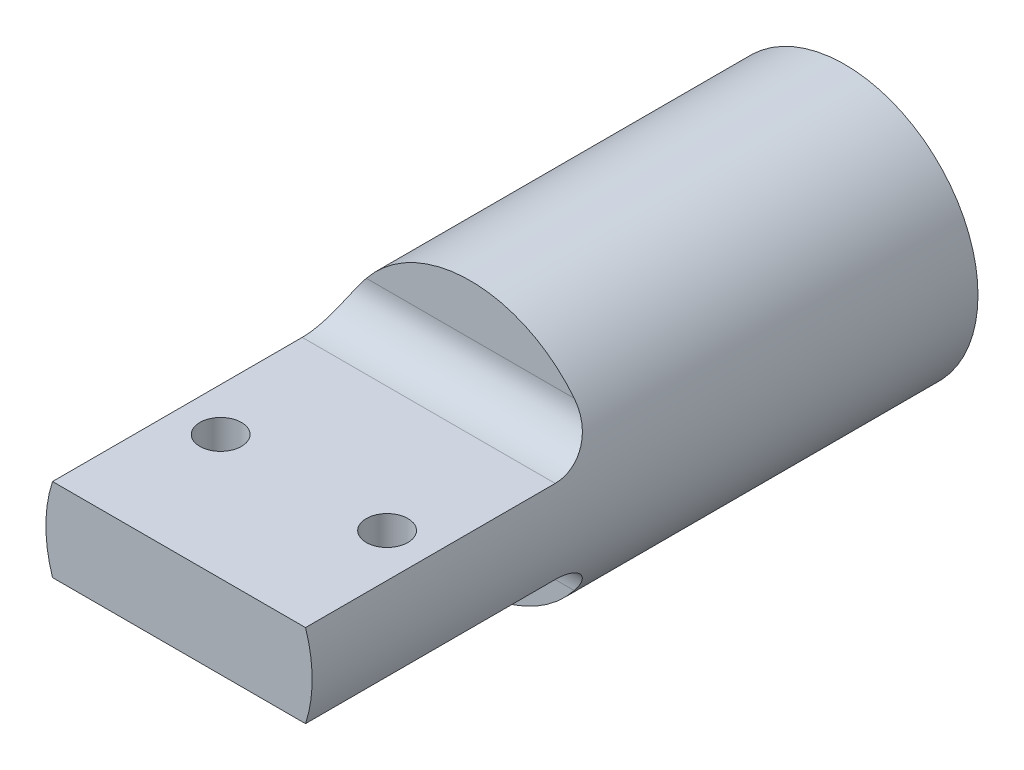
ISO-10303-21;
HEADER;
FILE_DESCRIPTION(('STEP AP214'),'2;1');
FILE_NAME('part.step','',(''),(''),'','','');
FILE_SCHEMA(('AUTOMOTIVE_DESIGN { 1 0 10303 214 1 1 1 1 }'));
ENDSEC;
DATA;
#1=APPLICATION_CONTEXT('core data for automotive mechanical design processes');
#2=APPLICATION_PROTOCOL_DEFINITION('international standard','automotive_design',2000,#1);
#3=PRODUCT_CONTEXT('',#1,'mechanical');
#4=PRODUCT('Part','Part','',(#3));
#5=PRODUCT_RELATED_PRODUCT_CATEGORY('part','',(#4));
#6=PRODUCT_DEFINITION_FORMATION('','',#4);
#7=PRODUCT_DEFINITION_CONTEXT('part definition',#1,'design');
#8=PRODUCT_DEFINITION('design','',#6,#7);
#9=PRODUCT_DEFINITION_SHAPE('','',#8);
#10=(LENGTH_UNIT() NAMED_UNIT(*) SI_UNIT(.MILLI.,.METRE.));
#11=(NAMED_UNIT(*) PLANE_ANGLE_UNIT() SI_UNIT($,.RADIAN.));
#12=(NAMED_UNIT(*) SI_UNIT($,.STERADIAN.) SOLID_ANGLE_UNIT());
#13=UNCERTAINTY_MEASURE_WITH_UNIT(LENGTH_MEASURE(1.E-05),#10,'distance_accuracy_value','');
#14=(GEOMETRIC_REPRESENTATION_CONTEXT(3) GLOBAL_UNCERTAINTY_ASSIGNED_CONTEXT((#13)) GLOBAL_UNIT_ASSIGNED_CONTEXT((#10,
#11,#12)) REPRESENTATION_CONTEXT('',''));
#15=CARTESIAN_POINT('',(0.,0.,0.));
#16=DIRECTION('',(0.,0.,1.));
#17=DIRECTION('',(1.,0.,0.));
#18=AXIS2_PLACEMENT_3D('',#15,#16,#17);
#19=CARTESIAN_POINT('',(0.,-5.,0.));
#20=DIRECTION('',(0.,1.,0.));
#21=DIRECTION('',(0.,0.,1.));
#22=AXIS2_PLACEMENT_3D('',#19,#20,#21);
#23=PLANE('',#22);
#24=DIRECTION('',(0.,0.,-1.));
#25=VECTOR('',#24,1.);
#26=CARTESIAN_POINT('',(-15.1986841535707,-5.,80.));
#27=LINE('',#26,#25);
#28=CARTESIAN_POINT('',(-15.1986841535707,-5.,50.));
#29=VERTEX_POINT('',#28);
#30=CARTESIAN_POINT('',(-15.1986841535707,-5.,80.));
#31=VERTEX_POINT('',#30);
#32=EDGE_CURVE('E104',#29,#31,#27,.F.);
#33=ORIENTED_EDGE('',*,*,#32,.F.);
#34=DIRECTION('',(1.,0.,0.));
#35=VECTOR('',#34,1.);
#36=CARTESIAN_POINT('',(0.,-5.,50.));
#37=LINE('',#36,#35);
#38=CARTESIAN_POINT('',(15.1986841535707,-5.,50.));
#39=VERTEX_POINT('',#38);
#40=EDGE_CURVE('E111',#29,#39,#37,.T.);
#41=ORIENTED_EDGE('',*,*,#40,.T.);
#42=DIRECTION('',(0.,0.,-1.));
#43=VECTOR('',#42,1.);
#44=CARTESIAN_POINT('',(15.1986841535707,-5.,80.));
#45=LINE('',#44,#43);
#46=CARTESIAN_POINT('',(15.1986841535707,-5.,80.));
#47=VERTEX_POINT('',#46);
#48=EDGE_CURVE('E117',#47,#39,#45,.T.);
#49=ORIENTED_EDGE('',*,*,#48,.F.);
#50=DIRECTION('',(1.,0.,0.));
#51=VECTOR('',#50,1.);
#52=CARTESIAN_POINT('',(-16.,-5.,80.));
#53=LINE('',#52,#51);
#54=EDGE_CURVE('E101',#31,#47,#53,.T.);
#55=ORIENTED_EDGE('',*,*,#54,.F.);
#56=EDGE_LOOP('',(#33,#41,#49,#55));
#57=FACE_BOUND('',#56,.T.);
#58=CARTESIAN_POINT('',(10.,-5.,65.));
#59=DIRECTION('',(0.,1.,0.));
#60=DIRECTION('',(0.,0.,1.));
#61=AXIS2_PLACEMENT_3D('',#58,#59,#60);
#62=CIRCLE('',#61,2.5);
#63=CARTESIAN_POINT('',(10.,-5.,67.5));
#64=VERTEX_POINT('',#63);
#65=EDGE_CURVE('E303',#64,#64,#62,.F.);
#66=ORIENTED_EDGE('',*,*,#65,.F.);
#67=EDGE_LOOP('',(#66));
#68=FACE_BOUND('',#67,.T.);
#69=CARTESIAN_POINT('',(-10.,-5.,65.));
#70=DIRECTION('',(0.,1.,0.));
#71=DIRECTION('',(0.,0.,1.));
#72=AXIS2_PLACEMENT_3D('',#69,#70,#71);
#73=CIRCLE('',#72,2.5);
#74=CARTESIAN_POINT('',(-10.,-5.,67.5));
#75=VERTEX_POINT('',#74);
#76=EDGE_CURVE('E300',#75,#75,#73,.T.);
#77=ORIENTED_EDGE('',*,*,#76,.T.);
#78=EDGE_LOOP('',(#77));
#79=FACE_BOUND('',#78,.T.);
#80=ADVANCED_FACE('F37',(#57,#68,#79),#23,.F.);
#81=CARTESIAN_POINT('',(0.,5.,0.));
#82=DIRECTION('',(0.,1.,0.));
#83=DIRECTION('',(0.,0.,1.));
#84=AXIS2_PLACEMENT_3D('',#81,#82,#83);
#85=PLANE('',#84);
#86=DIRECTION('',(0.,0.,-1.));
#87=VECTOR('',#86,1.);
#88=CARTESIAN_POINT('',(15.1986841535707,5.,80.));
#89=LINE('',#88,#87);
#90=CARTESIAN_POINT('',(15.1986841535707,5.,80.));
#91=VERTEX_POINT('',#90);
#92=CARTESIAN_POINT('',(15.1986841535707,5.,50.));
#93=VERTEX_POINT('',#92);
#94=EDGE_CURVE('E107',#91,#93,#89,.T.);
#95=ORIENTED_EDGE('',*,*,#94,.T.);
#96=DIRECTION('',(1.,0.,0.));
#97=VECTOR('',#96,1.);
#98=CARTESIAN_POINT('',(-15.1986841535707,5.,50.));
#99=LINE('',#98,#97);
#100=CARTESIAN_POINT('',(-15.1986841535707,5.,50.));
#101=VERTEX_POINT('',#100);
#102=EDGE_CURVE('E64',#93,#101,#99,.F.);
#103=ORIENTED_EDGE('',*,*,#102,.T.);
#104=DIRECTION('',(0.,0.,-1.));
#105=VECTOR('',#104,1.);
#106=CARTESIAN_POINT('',(-15.1986841535707,5.,80.));
#107=LINE('',#106,#105);
#108=CARTESIAN_POINT('',(-15.1986841535707,5.,80.));
#109=VERTEX_POINT('',#108);
#110=EDGE_CURVE('E112',#101,#109,#107,.F.);
#111=ORIENTED_EDGE('',*,*,#110,.T.);
#112=DIRECTION('',(1.,0.,0.));
#113=VECTOR('',#112,1.);
#114=CARTESIAN_POINT('',(-16.,5.,80.));
#115=LINE('',#114,#113);
#116=EDGE_CURVE('E99',#109,#91,#115,.T.);
#117=ORIENTED_EDGE('',*,*,#116,.T.);
#118=EDGE_LOOP('',(#95,#103,#111,#117));
#119=FACE_BOUND('',#118,.T.);
#120=CARTESIAN_POINT('',(10.,5.,65.));
#121=DIRECTION('',(0.,1.,0.));
#122=DIRECTION('',(0.,0.,1.));
#123=AXIS2_PLACEMENT_3D('',#120,#121,#122);
#124=CIRCLE('',#123,2.5);
#125=CARTESIAN_POINT('',(10.,5.,67.5));
#126=VERTEX_POINT('',#125);
#127=EDGE_CURVE('E307',#126,#126,#124,.F.);
#128=ORIENTED_EDGE('',*,*,#127,.T.);
#129=EDGE_LOOP('',(#128));
#130=FACE_BOUND('',#129,.T.);
#131=CARTESIAN_POINT('',(-10.,5.,65.));
#132=DIRECTION('',(0.,1.,0.));
#133=DIRECTION('',(0.,0.,1.));
#134=AXIS2_PLACEMENT_3D('',#131,#132,#133);
#135=CIRCLE('',#134,2.5);
#136=CARTESIAN_POINT('',(-10.,5.,67.5));
#137=VERTEX_POINT('',#136);
#138=EDGE_CURVE('E306',#137,#137,#135,.T.);
#139=ORIENTED_EDGE('',*,*,#138,.F.);
#140=EDGE_LOOP('',(#139));
#141=FACE_BOUND('',#140,.T.);
#142=ADVANCED_FACE('F114',(#119,#130,#141),#85,.T.);
#143=CARTESIAN_POINT('',(-16.,-5.,80.));
#144=DIRECTION('',(0.,0.,1.));
#145=DIRECTION('',(1.,0.,0.));
#146=AXIS2_PLACEMENT_3D('',#143,#144,#145);
#147=PLANE('',#146);
#148=ORIENTED_EDGE('',*,*,#116,.F.);
#149=CARTESIAN_POINT('',(0.,0.,80.));
#150=DIRECTION('',(0.,0.,-1.));
#151=DIRECTION('',(-1.,0.,0.));
#152=AXIS2_PLACEMENT_3D('',#149,#150,#151);
#153=CIRCLE('',#152,16.);
#154=EDGE_CURVE('E105',#31,#109,#153,.T.);
#155=ORIENTED_EDGE('',*,*,#154,.F.);
#156=ORIENTED_EDGE('',*,*,#54,.T.);
#157=EDGE_CURVE('E95',#91,#47,#153,.T.);
#158=ORIENTED_EDGE('',*,*,#157,.F.);
#159=EDGE_LOOP('',(#148,#155,#156,#158));
#160=FACE_BOUND('',#159,.T.);
#161=ADVANCED_FACE('F96',(#160),#147,.T.);
#162=CARTESIAN_POINT('',(0.,0.,0.));
#163=DIRECTION('',(0.,0.,1.));
#164=DIRECTION('',(1.,0.,0.));
#165=AXIS2_PLACEMENT_3D('',#162,#163,#164);
#166=PLANE('',#165);
#167=CARTESIAN_POINT('',(0.,0.,0.));
#168=DIRECTION('',(0.,0.,1.));
#169=DIRECTION('',(1.,0.,0.));
#170=AXIS2_PLACEMENT_3D('',#167,#168,#169);
#171=CIRCLE('',#170,16.);
#172=CARTESIAN_POINT('',(16.,0.,0.));
#173=VERTEX_POINT('',#172);
#174=EDGE_CURVE('E127',#173,#173,#171,.T.);
#175=ORIENTED_EDGE('',*,*,#174,.F.);
#176=EDGE_LOOP('',(#175));
#177=FACE_BOUND('',#176,.T.);
#178=CARTESIAN_POINT('',(0.,0.,0.));
#179=DIRECTION('',(0.,0.,1.));
#180=DIRECTION('',(1.,0.,0.));
#181=AXIS2_PLACEMENT_3D('',#178,#179,#180);
#182=CIRCLE('',#181,11.);
#183=CARTESIAN_POINT('',(11.,0.,0.));
#184=VERTEX_POINT('',#183);
#185=EDGE_CURVE('E119',#184,#184,#182,.T.);
#186=ORIENTED_EDGE('',*,*,#185,.T.);
#187=EDGE_LOOP('',(#186));
#188=FACE_BOUND('',#187,.T.);
#189=ADVANCED_FACE('F188',(#177,#188),#166,.F.);
#190=CARTESIAN_POINT('',(0.,0.,40.));
#191=DIRECTION('',(0.,0.,-1.));
#192=DIRECTION('',(-1.,0.,0.));
#193=AXIS2_PLACEMENT_3D('',#190,#191,#192);
#194=CYLINDRICAL_SURFACE('',#193,16.);
#195=CARTESIAN_POINT('',(0.,0.,45.));
#196=DIRECTION('',(0.,0.,1.));
#197=DIRECTION('',(1.,0.,0.));
#198=AXIS2_PLACEMENT_3D('',#195,#196,#197);
#199=CIRCLE('',#198,16.);
#200=CARTESIAN_POINT('',(-12.4899959967968,-10.,45.));
#201=VERTEX_POINT('',#200);
#202=CARTESIAN_POINT('',(12.4899959967968,-10.,45.));
#203=VERTEX_POINT('',#202);
#204=EDGE_CURVE('E290',#201,#203,#199,.T.);
#205=ORIENTED_EDGE('',*,*,#204,.F.);
#206=CARTESIAN_POINT('',(-12.4899959967968,-10.,45.));
#207=CARTESIAN_POINT('',(-12.600331952659,-9.86222903617671,44.9999952374629));
#208=CARTESIAN_POINT('',(-12.7083946214528,-9.72254818041764,45.0056959791728));
#209=CARTESIAN_POINT('',(-12.9195002586332,-9.44020223665848,45.029415002373));
#210=CARTESIAN_POINT('',(-13.0225367167774,-9.29753360339066,45.0474488271328));
#211=CARTESIAN_POINT('',(-13.2232961482015,-9.00973976843352,45.0968585548129));
#212=CARTESIAN_POINT('',(-13.3209924771084,-8.8646062813635,45.1282954961815));
#213=CARTESIAN_POINT('',(-13.5099006525632,-8.57394795633921,45.2053196764436));
#214=CARTESIAN_POINT('',(-13.6011158760118,-8.42842336380184,45.2508994789328));
#215=CARTESIAN_POINT('',(-13.7624992176116,-8.16173320901749,45.3483784367243));
#216=CARTESIAN_POINT('',(-13.8337000887229,-8.04039474253123,45.3981004895474));
#217=CARTESIAN_POINT('',(-13.9708594164327,-7.79963274255593,45.5082408035204));
#218=CARTESIAN_POINT('',(-14.0368187480734,-7.68020889210224,45.5686572738457));
#219=CARTESIAN_POINT('',(-14.1631394380018,-7.44468311940585,45.7001731495508));
#220=CARTESIAN_POINT('',(-14.2235115763714,-7.32857511213357,45.7712512585963));
#221=CARTESIAN_POINT('',(-14.3386093754636,-7.10074388553715,45.9240805856789));
#222=CARTESIAN_POINT('',(-14.3933376819721,-6.98901862697411,46.0058267615132));
#223=CARTESIAN_POINT('',(-14.4973643138585,-6.77060849833264,46.1802275701305));
#224=CARTESIAN_POINT('',(-14.5466324851401,-6.66395331280572,46.2729374504786));
#225=CARTESIAN_POINT('',(-14.639399117175,-6.45761516469905,46.4684690362881));
#226=CARTESIAN_POINT('',(-14.6828974270003,-6.35793238453568,46.5712910061389));
#227=CARTESIAN_POINT('',(-14.7642202695102,-6.16673365403791,46.7864667389672));
#228=CARTESIAN_POINT('',(-14.8020413894476,-6.07522262929909,46.8988261722097));
#229=CARTESIAN_POINT('',(-14.8721178301203,-5.901599762871,47.132202302159));
#230=CARTESIAN_POINT('',(-14.9043736236253,-5.81948712299682,47.2532182622647));
#231=CARTESIAN_POINT('',(-14.9611775492608,-5.67176584769048,47.4930823586906));
#232=CARTESIAN_POINT('',(-14.9861330502165,-5.60536616944647,47.6113479702924));
#233=CARTESIAN_POINT('',(-15.0316567488519,-5.48211756605954,47.8535606485813));
#234=CARTESIAN_POINT('',(-15.0522251204912,-5.42526826224188,47.977507489758));
#235=CARTESIAN_POINT('',(-15.0891360998023,-5.32174731337007,48.2300949497665));
#236=CARTESIAN_POINT('',(-15.105481539012,-5.27506885192346,48.3587323571188));
#237=CARTESIAN_POINT('',(-15.1341212942656,-5.19232912899181,48.6197616045545));
#238=CARTESIAN_POINT('',(-15.14641650593,-5.15626552044892,48.7521526075694));
#239=CARTESIAN_POINT('',(-15.1708484492499,-5.08402782193875,49.0682679026306));
#240=CARTESIAN_POINT('',(-15.1813172687334,-5.05253773080228,49.2532290968195));
#241=CARTESIAN_POINT('',(-15.191753294537,-5.02102910957874,49.5324142838184));
#242=CARTESIAN_POINT('',(-15.1943541125414,-5.01314733174432,49.6257343967451));
#243=CARTESIAN_POINT('',(-15.1978182255681,-5.00263324570863,49.8126941262772));
#244=CARTESIAN_POINT('',(-15.1986816679717,-5.00000049223338,49.9063337151063));
#245=CARTESIAN_POINT('',(-15.1986841535707,-5.,50.));
#246=B_SPLINE_CURVE_WITH_KNOTS('',3,(#206,#207,#208,#209,#210,#211,#212,#213,#214,#215,#216,
#217,#218,#219,#220,#221,#222,#223,#224,#225,#226,#227,#228,#229,#230,#231,#232,#233,#234,#235,
#236,#237,#238,#239,#240,#241,#242,#243,#244,#245),.UNSPECIFIED.,.F.,.F.,(4,2,2,2,2,2,2,2,2,2,2,
2,2,2,2,2,2,2,2,4),(0.,0.529510604269669,1.05968977860204,1.59230964757548,2.1246499349314,
2.57183709009181,3.01894943262078,3.46518028905748,3.91120099567281,4.35957357771012,
4.80795788596377,5.25661066268608,5.70522530796087,6.11843852749908,6.53163535916057,
6.94455441300638,7.35738209731477,7.91962281215641,8.20055126590746,8.48145588752518),.UNSPECIFIED.);
#247=EDGE_CURVE('E147',#201,#29,#246,.T.);
#248=ORIENTED_EDGE('',*,*,#247,.T.);
#249=ORIENTED_EDGE('',*,*,#32,.T.);
#250=ORIENTED_EDGE('',*,*,#154,.T.);
#251=ORIENTED_EDGE('',*,*,#110,.F.);
#252=CARTESIAN_POINT('',(-15.1986841535707,5.,50.));
#253=CARTESIAN_POINT('',(-15.1986766764511,4.99998207898774,49.8661485794503));
#254=CARTESIAN_POINT('',(-15.1969157844884,5.00537410108931,49.7322992557525));
#255=CARTESIAN_POINT('',(-15.1898329403202,5.02684908064224,49.4655627845222));
#256=CARTESIAN_POINT('',(-15.1845111795853,5.04293146326459,49.3326755856438));
#257=CARTESIAN_POINT('',(-15.1702605643503,5.08563370875157,49.0689582387952));
#258=CARTESIAN_POINT('',(-15.1613358586158,5.11224145103182,48.9381259040717));
#259=CARTESIAN_POINT('',(-15.1397771581325,5.1757393981251,48.6792948183878));
#260=CARTESIAN_POINT('',(-15.127143213009,5.21262946537234,48.5512960295425));
#261=CARTESIAN_POINT('',(-15.0980322025276,5.29635579000828,48.2989993621655));
#262=CARTESIAN_POINT('',(-15.0815539599772,5.34319509363718,48.1747026304436));
#263=CARTESIAN_POINT('',(-15.0445992284306,5.44637830248103,47.9306803438991));
#264=CARTESIAN_POINT('',(-15.0241212729001,5.50272569289574,47.8109564850741));
#265=CARTESIAN_POINT('',(-14.9790229699752,5.62432852396012,47.5770121692552));
#266=CARTESIAN_POINT('',(-14.954404612836,5.68957968181649,47.4627891018522));
#267=CARTESIAN_POINT('',(-14.900854902103,5.828383649293,47.2405087213281));
#268=CARTESIAN_POINT('',(-14.8719219633529,5.90193950759721,47.1324536945758));
#269=CARTESIAN_POINT('',(-14.8095069356797,6.05685552252824,46.9228829144776));
#270=CARTESIAN_POINT('',(-14.7760095752668,6.13824159644321,46.8213908759825));
#271=CARTESIAN_POINT('',(-14.7044235218652,6.30780453904752,46.6259164701966));
#272=CARTESIAN_POINT('',(-14.6663331628577,6.3959838676413,46.531936848565));
#273=CARTESIAN_POINT('',(-14.5855377048815,6.57814619187261,46.3520845404436));
#274=CARTESIAN_POINT('',(-14.5428360674511,6.67212481176709,46.2662058623281));
#275=CARTESIAN_POINT('',(-14.4527665661611,6.86504726793572,46.1028141694271));
#276=CARTESIAN_POINT('',(-14.4053970244498,6.96399288325282,46.0253041838541));
#277=CARTESIAN_POINT('',(-14.3044983751599,7.16901522465785,45.8766453605367));
#278=CARTESIAN_POINT('',(-14.2508234531491,7.27521804780295,45.8057695604748));
#279=CARTESIAN_POINT('',(-14.1386531621833,7.49087884713988,45.6732998394309));
#280=CARTESIAN_POINT('',(-14.0801558107093,7.60033815014525,45.6117097655769));
#281=CARTESIAN_POINT('',(-13.9584194413695,7.82166878376452,45.497734597612));
#282=CARTESIAN_POINT('',(-13.8951726793524,7.9335438321117,45.4453650242204));
#283=CARTESIAN_POINT('',(-13.7642293866937,8.15861193867894,45.3498126808048));
#284=CARTESIAN_POINT('',(-13.6965322222268,8.27180518273898,45.3066312230767));
#285=CARTESIAN_POINT('',(-13.5426671290002,8.52184696452857,45.2213081729626));
#286=CARTESIAN_POINT('',(-13.4555516844941,8.65880257390231,45.1811823375663));
#287=CARTESIAN_POINT('',(-13.2756799253766,8.93213988648186,45.1133325232941));
#288=CARTESIAN_POINT('',(-13.1829210798042,9.06852130241619,45.0856141562107));
#289=CARTESIAN_POINT('',(-12.9926746232483,9.33903666414921,45.0419935990581));
#290=CARTESIAN_POINT('',(-12.8952066936302,9.47317726329251,45.0260461129786));
#291=CARTESIAN_POINT('',(-12.6958270023584,9.73877198871524,45.005053444717));
#292=CARTESIAN_POINT('',(-12.5939200943071,9.87022882929432,44.9999966454392));
#293=CARTESIAN_POINT('',(-12.4899959967968,10.,45.));
#294=B_SPLINE_CURVE_WITH_KNOTS('',3,(#252,#253,#254,#255,#256,#257,#258,#259,#260,#261,#262,
#263,#264,#265,#266,#267,#268,#269,#270,#271,#272,#273,#274,#275,#276,#277,#278,#279,#280,#281,
#282,#283,#284,#285,#286,#287,#288,#289,#290,#291,#292,#293),.UNSPECIFIED.,.F.,.F.,(4,2,2,2,2,2,
2,2,2,2,2,2,2,2,2,2,2,2,2,2,4),(0.,0.40143117742957,0.802840771338058,1.20378945736879,
1.60473277942033,2.0057990390215,2.40701263053028,2.80803391050557,3.20920288840254,
3.61174864103098,4.01444085085461,4.41683284672802,4.81937001139568,5.2344346319642,
5.64967074632655,6.06559927400998,6.48158716701612,6.98258328468605,7.4838057702457,
7.98308927908098,8.48183993785733),.UNSPECIFIED.);
#295=CARTESIAN_POINT('',(-12.4899959967968,10.,45.));
#296=VERTEX_POINT('',#295);
#297=EDGE_CURVE('E11',#101,#296,#294,.T.);
#298=ORIENTED_EDGE('',*,*,#297,.T.);
#299=CARTESIAN_POINT('',(12.4899959967968,10.,45.));
#300=VERTEX_POINT('',#299);
#301=EDGE_CURVE('E292',#300,#296,#199,.T.);
#302=ORIENTED_EDGE('',*,*,#301,.F.);
#303=CARTESIAN_POINT('',(12.4899959967968,10.,45.));
#304=CARTESIAN_POINT('',(12.600331952659,9.86222903617671,44.9999952374629));
#305=CARTESIAN_POINT('',(12.7083946214528,9.72254818041764,45.0056959791728));
#306=CARTESIAN_POINT('',(12.9195002586332,9.44020223665848,45.029415002373));
#307=CARTESIAN_POINT('',(13.0225367167774,9.29753360339066,45.0474488271328));
#308=CARTESIAN_POINT('',(13.2232961482015,9.00973976843352,45.0968585548129));
#309=CARTESIAN_POINT('',(13.3209924771084,8.8646062813635,45.1282954961815));
#310=CARTESIAN_POINT('',(13.5099006525632,8.57394795633921,45.2053196764436));
#311=CARTESIAN_POINT('',(13.6011158760118,8.42842336380184,45.2508994789328));
#312=CARTESIAN_POINT('',(13.7624992176116,8.16173320901749,45.3483784367243));
#313=CARTESIAN_POINT('',(13.8337000887229,8.04039474253123,45.3981004895474));
#314=CARTESIAN_POINT('',(13.9708594164327,7.79963274255593,45.5082408035204));
#315=CARTESIAN_POINT('',(14.0368187480734,7.68020889210224,45.5686572738457));
#316=CARTESIAN_POINT('',(14.1631394380018,7.44468311940585,45.7001731495508));
#317=CARTESIAN_POINT('',(14.2235115763714,7.32857511213357,45.7712512585963));
#318=CARTESIAN_POINT('',(14.3386093754636,7.10074388553715,45.9240805856789));
#319=CARTESIAN_POINT('',(14.3933376819721,6.98901862697411,46.0058267615132));
#320=CARTESIAN_POINT('',(14.4973643138585,6.77060849833264,46.1802275701305));
#321=CARTESIAN_POINT('',(14.5466324851401,6.66395331280572,46.2729374504786));
#322=CARTESIAN_POINT('',(14.639399117175,6.45761516469905,46.4684690362881));
#323=CARTESIAN_POINT('',(14.6828974270003,6.35793238453568,46.5712910061389));
#324=CARTESIAN_POINT('',(14.7642202695102,6.16673365403791,46.7864667389672));
#325=CARTESIAN_POINT('',(14.8020413894476,6.07522262929909,46.8988261722097));
#326=CARTESIAN_POINT('',(14.8721178301203,5.901599762871,47.132202302159));
#327=CARTESIAN_POINT('',(14.9043736236253,5.81948712299682,47.2532182622647));
#328=CARTESIAN_POINT('',(14.9611775492608,5.67176584769048,47.4930823586906));
#329=CARTESIAN_POINT('',(14.9861330502165,5.60536616944647,47.6113479702924));
#330=CARTESIAN_POINT('',(15.0316567488519,5.48211756605954,47.8535606485813));
#331=CARTESIAN_POINT('',(15.0522251204912,5.42526826224188,47.977507489758));
#332=CARTESIAN_POINT('',(15.0891360998023,5.32174731337007,48.2300949497665));
#333=CARTESIAN_POINT('',(15.105481539012,5.27506885192346,48.3587323571188));
#334=CARTESIAN_POINT('',(15.1341212942656,5.19232912899181,48.6197616045545));
#335=CARTESIAN_POINT('',(15.14641650593,5.15626552044892,48.7521526075694));
#336=CARTESIAN_POINT('',(15.1708484492499,5.08402782193875,49.0682679026306));
#337=CARTESIAN_POINT('',(15.1813172687334,5.05253773080228,49.2532290968195));
#338=CARTESIAN_POINT('',(15.191753294537,5.02102910957874,49.5324142838184));
#339=CARTESIAN_POINT('',(15.1943541125414,5.01314733174432,49.6257343967451));
#340=CARTESIAN_POINT('',(15.1978182255681,5.00263324570863,49.8126941262772));
#341=CARTESIAN_POINT('',(15.1986816679717,5.00000049223338,49.9063337151063));
#342=CARTESIAN_POINT('',(15.1986841535707,5.,50.));
#343=B_SPLINE_CURVE_WITH_KNOTS('',3,(#303,#304,#305,#306,#307,#308,#309,#310,#311,#312,#313,
#314,#315,#316,#317,#318,#319,#320,#321,#322,#323,#324,#325,#326,#327,#328,#329,#330,#331,#332,
#333,#334,#335,#336,#337,#338,#339,#340,#341,#342),.UNSPECIFIED.,.F.,.F.,(4,2,2,2,2,2,2,2,2,2,2,
2,2,2,2,2,2,2,2,4),(0.,0.529510604269669,1.05968977860204,1.59230964757548,2.1246499349314,
2.57183709009181,3.01894943262078,3.46518028905748,3.91120099567281,4.35957357771012,
4.80795788596377,5.25661066268608,5.70522530796087,6.11843852749908,6.53163535916057,
6.94455441300638,7.35738209731477,7.91962281215641,8.20055126590746,8.48145588752518),.UNSPECIFIED.);
#344=EDGE_CURVE('E51',#300,#93,#343,.T.);
#345=ORIENTED_EDGE('',*,*,#344,.T.);
#346=ORIENTED_EDGE('',*,*,#94,.F.);
#347=ORIENTED_EDGE('',*,*,#157,.T.);
#348=ORIENTED_EDGE('',*,*,#48,.T.);
#349=CARTESIAN_POINT('',(15.1986841535707,-5.,50.));
#350=CARTESIAN_POINT('',(15.1986766764511,-4.99998207898774,49.8661485794503));
#351=CARTESIAN_POINT('',(15.1969157844884,-5.00537410108931,49.7322992557525));
#352=CARTESIAN_POINT('',(15.1898329403202,-5.02684908064224,49.4655627845222));
#353=CARTESIAN_POINT('',(15.1845111795853,-5.04293146326459,49.3326755856438));
#354=CARTESIAN_POINT('',(15.1702605643503,-5.08563370875157,49.0689582387952));
#355=CARTESIAN_POINT('',(15.1613358586158,-5.11224145103182,48.9381259040717));
#356=CARTESIAN_POINT('',(15.1397771581325,-5.1757393981251,48.6792948183878));
#357=CARTESIAN_POINT('',(15.127143213009,-5.21262946537234,48.5512960295425));
#358=CARTESIAN_POINT('',(15.0980322025276,-5.29635579000828,48.2989993621655));
#359=CARTESIAN_POINT('',(15.0815539599772,-5.34319509363718,48.1747026304436));
#360=CARTESIAN_POINT('',(15.0445992284306,-5.44637830248103,47.9306803438991));
#361=CARTESIAN_POINT('',(15.0241212729001,-5.50272569289574,47.8109564850741));
#362=CARTESIAN_POINT('',(14.9790229699752,-5.62432852396012,47.5770121692552));
#363=CARTESIAN_POINT('',(14.954404612836,-5.68957968181649,47.4627891018522));
#364=CARTESIAN_POINT('',(14.900854902103,-5.828383649293,47.2405087213281));
#365=CARTESIAN_POINT('',(14.8719219633529,-5.90193950759721,47.1324536945758));
#366=CARTESIAN_POINT('',(14.8095069356797,-6.05685552252824,46.9228829144776));
#367=CARTESIAN_POINT('',(14.7760095752668,-6.13824159644321,46.8213908759825));
#368=CARTESIAN_POINT('',(14.7044235218652,-6.30780453904752,46.6259164701966));
#369=CARTESIAN_POINT('',(14.6663331628577,-6.3959838676413,46.531936848565));
#370=CARTESIAN_POINT('',(14.5855377048815,-6.57814619187261,46.3520845404436));
#371=CARTESIAN_POINT('',(14.5428360674511,-6.67212481176709,46.2662058623281));
#372=CARTESIAN_POINT('',(14.4527665661611,-6.86504726793572,46.1028141694271));
#373=CARTESIAN_POINT('',(14.4053970244498,-6.96399288325282,46.0253041838541));
#374=CARTESIAN_POINT('',(14.3044983751599,-7.16901522465785,45.8766453605367));
#375=CARTESIAN_POINT('',(14.2508234531491,-7.27521804780295,45.8057695604748));
#376=CARTESIAN_POINT('',(14.1386531621833,-7.49087884713988,45.6732998394309));
#377=CARTESIAN_POINT('',(14.0801558107093,-7.60033815014525,45.6117097655769));
#378=CARTESIAN_POINT('',(13.9584194413695,-7.82166878376452,45.497734597612));
#379=CARTESIAN_POINT('',(13.8951726793524,-7.9335438321117,45.4453650242204));
#380=CARTESIAN_POINT('',(13.7642293866937,-8.15861193867894,45.3498126808048));
#381=CARTESIAN_POINT('',(13.6965322222268,-8.27180518273898,45.3066312230767));
#382=CARTESIAN_POINT('',(13.5426671290002,-8.52184696452857,45.2213081729626));
#383=CARTESIAN_POINT('',(13.4555516844941,-8.65880257390231,45.1811823375663));
#384=CARTESIAN_POINT('',(13.2756799253766,-8.93213988648186,45.1133325232941));
#385=CARTESIAN_POINT('',(13.1829210798042,-9.06852130241619,45.0856141562107));
#386=CARTESIAN_POINT('',(12.9926746232483,-9.33903666414921,45.0419935990581));
#387=CARTESIAN_POINT('',(12.8952066936302,-9.47317726329251,45.0260461129786));
#388=CARTESIAN_POINT('',(12.6958270023584,-9.73877198871524,45.005053444717));
#389=CARTESIAN_POINT('',(12.5939200943071,-9.87022882929432,44.9999966454392));
#390=CARTESIAN_POINT('',(12.4899959967968,-10.,45.));
#391=B_SPLINE_CURVE_WITH_KNOTS('',3,(#349,#350,#351,#352,#353,#354,#355,#356,#357,#358,#359,
#360,#361,#362,#363,#364,#365,#366,#367,#368,#369,#370,#371,#372,#373,#374,#375,#376,#377,#378,
#379,#380,#381,#382,#383,#384,#385,#386,#387,#388,#389,#390),.UNSPECIFIED.,.F.,.F.,(4,2,2,2,2,2,
2,2,2,2,2,2,2,2,2,2,2,2,2,2,4),(0.,0.40143117742957,0.802840771338058,1.20378945736879,
1.60473277942033,2.0057990390215,2.40701263053028,2.80803391050557,3.20920288840254,
3.61174864103098,4.01444085085461,4.41683284672802,4.81937001139568,5.2344346319642,
5.64967074632655,6.06559927400998,6.48158716701612,6.98258328468605,7.4838057702457,
7.98308927908098,8.48183993785733),.UNSPECIFIED.);
#392=EDGE_CURVE('E141',#39,#203,#391,.T.);
#393=ORIENTED_EDGE('',*,*,#392,.T.);
#394=EDGE_LOOP('',(#205,#248,#249,#250,#251,#298,#302,#345,#346,#347,#348,#393));
#395=FACE_BOUND('',#394,.T.);
#396=ORIENTED_EDGE('',*,*,#174,.T.);
#397=EDGE_LOOP('',(#396));
#398=FACE_BOUND('',#397,.T.);
#399=ADVANCED_FACE('F109',(#395,#398),#194,.T.);
#400=CARTESIAN_POINT('',(0.,0.,40.));
#401=DIRECTION('',(0.,0.,-1.));
#402=DIRECTION('',(-1.,0.,0.));
#403=AXIS2_PLACEMENT_3D('',#400,#401,#402);
#404=CYLINDRICAL_SURFACE('',#403,11.);
#405=CARTESIAN_POINT('',(0.,0.,40.));
#406=DIRECTION('',(0.,0.,1.));
#407=DIRECTION('',(1.,0.,0.));
#408=AXIS2_PLACEMENT_3D('',#405,#406,#407);
#409=CIRCLE('',#408,11.);
#410=CARTESIAN_POINT('',(11.,0.,40.));
#411=VERTEX_POINT('',#410);
#412=EDGE_CURVE('E124',#411,#411,#409,.T.);
#413=ORIENTED_EDGE('',*,*,#412,.T.);
#414=EDGE_LOOP('',(#413));
#415=FACE_BOUND('',#414,.T.);
#416=ORIENTED_EDGE('',*,*,#185,.F.);
#417=EDGE_LOOP('',(#416));
#418=FACE_BOUND('',#417,.T.);
#419=ADVANCED_FACE('F184',(#415,#418),#404,.F.);
#420=CARTESIAN_POINT('',(-16.,-5.,40.));
#421=DIRECTION('',(0.,0.,-1.));
#422=DIRECTION('',(-1.,0.,0.));
#423=AXIS2_PLACEMENT_3D('',#420,#421,#422);
#424=PLANE('',#423);
#425=ORIENTED_EDGE('',*,*,#412,.F.);
#426=EDGE_LOOP('',(#425));
#427=FACE_BOUND('',#426,.T.);
#428=ADVANCED_FACE('F180',(#427),#424,.T.);
#429=CARTESIAN_POINT('',(10.,-16.,65.));
#430=DIRECTION('',(0.,1.,0.));
#431=DIRECTION('',(0.,0.,1.));
#432=AXIS2_PLACEMENT_3D('',#429,#430,#431);
#433=CYLINDRICAL_SURFACE('',#432,2.5);
#434=CARTESIAN_POINT('',(10.,5.,67.5));
#435=CARTESIAN_POINT('',(10.,4.89583333333333,67.5));
#436=CARTESIAN_POINT('',(10.,4.79166666666667,67.5));
#437=CARTESIAN_POINT('',(10.,4.58333333333333,67.5));
#438=CARTESIAN_POINT('',(10.,4.47916666666667,67.5));
#439=CARTESIAN_POINT('',(10.,4.27083333333333,67.5));
#440=CARTESIAN_POINT('',(10.,4.16666666666667,67.5));
#441=CARTESIAN_POINT('',(10.,3.95833333333333,67.5));
#442=CARTESIAN_POINT('',(10.,3.85416666666667,67.5));
#443=CARTESIAN_POINT('',(10.,3.64583333333333,67.5));
#444=CARTESIAN_POINT('',(10.,3.54166666666667,67.5));
#445=CARTESIAN_POINT('',(10.,3.33333333333333,67.5));
#446=CARTESIAN_POINT('',(10.,3.22916666666667,67.5));
#447=CARTESIAN_POINT('',(10.,3.02083333333333,67.5));
#448=CARTESIAN_POINT('',(10.,2.91666666666667,67.5));
#449=CARTESIAN_POINT('',(10.,2.70833333333333,67.5));
#450=CARTESIAN_POINT('',(10.,2.60416666666667,67.5));
#451=CARTESIAN_POINT('',(10.,2.39583333333333,67.5));
#452=CARTESIAN_POINT('',(10.,2.29166666666667,67.5));
#453=CARTESIAN_POINT('',(10.,2.08333333333333,67.5));
#454=CARTESIAN_POINT('',(10.,1.97916666666667,67.5));
#455=CARTESIAN_POINT('',(10.,1.77083333333333,67.5));
#456=CARTESIAN_POINT('',(10.,1.66666666666666,67.5));
#457=CARTESIAN_POINT('',(10.,1.45833333333333,67.5));
#458=CARTESIAN_POINT('',(10.,1.35416666666666,67.5));
#459=CARTESIAN_POINT('',(10.,1.14583333333333,67.5));
#460=CARTESIAN_POINT('',(10.,1.04166666666666,67.5));
#461=CARTESIAN_POINT('',(10.,0.833333333333331,67.5));
#462=CARTESIAN_POINT('',(10.,0.729166666666664,67.5));
#463=CARTESIAN_POINT('',(10.,0.52083333333333,67.5));
#464=CARTESIAN_POINT('',(10.,0.416666666666664,67.5));
#465=CARTESIAN_POINT('',(10.,0.20833333333333,67.5));
#466=CARTESIAN_POINT('',(10.,0.104166666666663,67.5));
#467=CARTESIAN_POINT('',(10.,-0.10416666666667,67.5));
#468=CARTESIAN_POINT('',(10.,-0.208333333333337,67.5));
#469=CARTESIAN_POINT('',(10.,-0.416666666666669,67.5));
#470=CARTESIAN_POINT('',(10.,-0.520833333333335,67.5));
#471=CARTESIAN_POINT('',(10.,-0.729166666666667,67.5));
#472=CARTESIAN_POINT('',(10.,-0.833333333333334,67.5));
#473=CARTESIAN_POINT('',(10.,-1.04166666666667,67.5));
#474=CARTESIAN_POINT('',(10.,-1.14583333333333,67.5));
#475=CARTESIAN_POINT('',(10.,-1.35416666666667,67.5));
#476=CARTESIAN_POINT('',(10.,-1.45833333333333,67.5));
#477=CARTESIAN_POINT('',(10.,-1.66666666666667,67.5));
#478=CARTESIAN_POINT('',(10.,-1.77083333333333,67.5));
#479=CARTESIAN_POINT('',(10.,-1.97916666666667,67.5));
#480=CARTESIAN_POINT('',(10.,-2.08333333333333,67.5));
#481=CARTESIAN_POINT('',(10.,-2.29166666666667,67.5));
#482=CARTESIAN_POINT('',(10.,-2.39583333333333,67.5));
#483=CARTESIAN_POINT('',(10.,-2.60416666666667,67.5));
#484=CARTESIAN_POINT('',(10.,-2.70833333333333,67.5));
#485=CARTESIAN_POINT('',(10.,-2.91666666666667,67.5));
#486=CARTESIAN_POINT('',(10.,-3.02083333333333,67.5));
#487=CARTESIAN_POINT('',(10.,-3.22916666666667,67.5));
#488=CARTESIAN_POINT('',(10.,-3.33333333333333,67.5));
#489=CARTESIAN_POINT('',(10.,-3.54166666666667,67.5));
#490=CARTESIAN_POINT('',(10.,-3.64583333333333,67.5));
#491=CARTESIAN_POINT('',(10.,-3.85416666666667,67.5));
#492=CARTESIAN_POINT('',(10.,-3.95833333333334,67.5));
#493=CARTESIAN_POINT('',(10.,-4.16666666666667,67.5));
#494=CARTESIAN_POINT('',(10.,-4.27083333333334,67.5));
#495=CARTESIAN_POINT('',(10.,-4.47916666666667,67.5));
#496=CARTESIAN_POINT('',(10.,-4.58333333333334,67.5));
#497=CARTESIAN_POINT('',(10.,-4.79166666666667,67.5));
#498=CARTESIAN_POINT('',(10.,-4.89583333333334,67.5));
#499=CARTESIAN_POINT('',(10.,-5.,67.5));
#500=B_SPLINE_CURVE_WITH_KNOTS('',3,(#434,#435,#436,#437,#438,#439,#440,#441,#442,#443,#444,
#445,#446,#447,#448,#449,#450,#451,#452,#453,#454,#455,#456,#457,#458,#459,#460,#461,#462,#463,
#464,#465,#466,#467,#468,#469,#470,#471,#472,#473,#474,#475,#476,#477,#478,#479,#480,#481,#482,
#483,#484,#485,#486,#487,#488,#489,#490,#491,#492,#493,#494,#495,#496,#497,#498,#499),
.UNSPECIFIED.,.F.,.F.,(4,2,2,2,2,2,2,2,2,2,2,2,2,2,2,2,2,2,2,2,2,2,2,2,2,2,2,2,2,2,2,2,4),(0.,
0.3125,0.625000000000001,0.937500000000001,1.25,1.5625,1.875,2.1875,2.5,2.8125,3.125,3.4375,
3.75,4.0625,4.375,4.6875,5.,5.3125,5.625,5.9375,6.25,6.5625,6.875,7.1875,7.5,7.8125,8.125,
8.4375,8.75,9.0625,9.375,9.6875,10.),.UNSPECIFIED.);
#501=EDGE_CURVE('BSEAM183',#126,#64,#500,.T.);
#502=ORIENTED_EDGE('',*,*,#127,.F.);
#503=ORIENTED_EDGE('',*,*,#65,.T.);
#504=ORIENTED_EDGE('',*,*,#501,.T.);
#505=ORIENTED_EDGE('',*,*,#501,.F.);
#506=EDGE_LOOP('',(#502,#504,#503,#505));
#507=FACE_BOUND('',#506,.T.);
#508=ADVANCED_FACE('F183',(#507),#433,.F.);
#509=CARTESIAN_POINT('',(-10.,-16.,65.));
#510=DIRECTION('',(0.,1.,0.));
#511=DIRECTION('',(0.,0.,1.));
#512=AXIS2_PLACEMENT_3D('',#509,#510,#511);
#513=CYLINDRICAL_SURFACE('',#512,2.5);
#514=CARTESIAN_POINT('',(-10.,5.,67.5));
#515=CARTESIAN_POINT('',(-10.,4.89583333333333,67.5));
#516=CARTESIAN_POINT('',(-10.,4.79166666666667,67.5));
#517=CARTESIAN_POINT('',(-10.,4.58333333333333,67.5));
#518=CARTESIAN_POINT('',(-10.,4.47916666666667,67.5));
#519=CARTESIAN_POINT('',(-10.,4.27083333333333,67.5));
#520=CARTESIAN_POINT('',(-10.,4.16666666666667,67.5));
#521=CARTESIAN_POINT('',(-10.,3.95833333333333,67.5));
#522=CARTESIAN_POINT('',(-10.,3.85416666666667,67.5));
#523=CARTESIAN_POINT('',(-10.,3.64583333333333,67.5));
#524=CARTESIAN_POINT('',(-10.,3.54166666666667,67.5));
#525=CARTESIAN_POINT('',(-10.,3.33333333333333,67.5));
#526=CARTESIAN_POINT('',(-10.,3.22916666666667,67.5));
#527=CARTESIAN_POINT('',(-10.,3.02083333333333,67.5));
#528=CARTESIAN_POINT('',(-10.,2.91666666666667,67.5));
#529=CARTESIAN_POINT('',(-10.,2.70833333333333,67.5));
#530=CARTESIAN_POINT('',(-10.,2.60416666666667,67.5));
#531=CARTESIAN_POINT('',(-10.,2.39583333333333,67.5));
#532=CARTESIAN_POINT('',(-10.,2.29166666666667,67.5));
#533=CARTESIAN_POINT('',(-10.,2.08333333333333,67.5));
#534=CARTESIAN_POINT('',(-10.,1.97916666666667,67.5));
#535=CARTESIAN_POINT('',(-10.,1.77083333333333,67.5));
#536=CARTESIAN_POINT('',(-10.,1.66666666666666,67.5));
#537=CARTESIAN_POINT('',(-10.,1.45833333333333,67.5));
#538=CARTESIAN_POINT('',(-10.,1.35416666666666,67.5));
#539=CARTESIAN_POINT('',(-10.,1.14583333333333,67.5));
#540=CARTESIAN_POINT('',(-10.,1.04166666666666,67.5));
#541=CARTESIAN_POINT('',(-10.,0.833333333333331,67.5));
#542=CARTESIAN_POINT('',(-10.,0.729166666666664,67.5));
#543=CARTESIAN_POINT('',(-10.,0.52083333333333,67.5));
#544=CARTESIAN_POINT('',(-10.,0.416666666666664,67.5));
#545=CARTESIAN_POINT('',(-10.,0.20833333333333,67.5));
#546=CARTESIAN_POINT('',(-10.,0.104166666666663,67.5));
#547=CARTESIAN_POINT('',(-10.,-0.10416666666667,67.5));
#548=CARTESIAN_POINT('',(-10.,-0.208333333333337,67.5));
#549=CARTESIAN_POINT('',(-10.,-0.416666666666669,67.5));
#550=CARTESIAN_POINT('',(-10.,-0.520833333333335,67.5));
#551=CARTESIAN_POINT('',(-10.,-0.729166666666667,67.5));
#552=CARTESIAN_POINT('',(-10.,-0.833333333333334,67.5));
#553=CARTESIAN_POINT('',(-10.,-1.04166666666667,67.5));
#554=CARTESIAN_POINT('',(-10.,-1.14583333333333,67.5));
#555=CARTESIAN_POINT('',(-10.,-1.35416666666667,67.5));
#556=CARTESIAN_POINT('',(-10.,-1.45833333333333,67.5));
#557=CARTESIAN_POINT('',(-10.,-1.66666666666667,67.5));
#558=CARTESIAN_POINT('',(-10.,-1.77083333333333,67.5));
#559=CARTESIAN_POINT('',(-10.,-1.97916666666667,67.5));
#560=CARTESIAN_POINT('',(-10.,-2.08333333333333,67.5));
#561=CARTESIAN_POINT('',(-10.,-2.29166666666667,67.5));
#562=CARTESIAN_POINT('',(-10.,-2.39583333333333,67.5));
#563=CARTESIAN_POINT('',(-10.,-2.60416666666667,67.5));
#564=CARTESIAN_POINT('',(-10.,-2.70833333333333,67.5));
#565=CARTESIAN_POINT('',(-10.,-2.91666666666667,67.5));
#566=CARTESIAN_POINT('',(-10.,-3.02083333333333,67.5));
#567=CARTESIAN_POINT('',(-10.,-3.22916666666667,67.5));
#568=CARTESIAN_POINT('',(-10.,-3.33333333333333,67.5));
#569=CARTESIAN_POINT('',(-10.,-3.54166666666667,67.5));
#570=CARTESIAN_POINT('',(-10.,-3.64583333333333,67.5));
#571=CARTESIAN_POINT('',(-10.,-3.85416666666667,67.5));
#572=CARTESIAN_POINT('',(-10.,-3.95833333333334,67.5));
#573=CARTESIAN_POINT('',(-10.,-4.16666666666667,67.5));
#574=CARTESIAN_POINT('',(-10.,-4.27083333333334,67.5));
#575=CARTESIAN_POINT('',(-10.,-4.47916666666667,67.5));
#576=CARTESIAN_POINT('',(-10.,-4.58333333333334,67.5));
#577=CARTESIAN_POINT('',(-10.,-4.79166666666667,67.5));
#578=CARTESIAN_POINT('',(-10.,-4.89583333333334,67.5));
#579=CARTESIAN_POINT('',(-10.,-5.,67.5));
#580=B_SPLINE_CURVE_WITH_KNOTS('',3,(#514,#515,#516,#517,#518,#519,#520,#521,#522,#523,#524,
#525,#526,#527,#528,#529,#530,#531,#532,#533,#534,#535,#536,#537,#538,#539,#540,#541,#542,#543,
#544,#545,#546,#547,#548,#549,#550,#551,#552,#553,#554,#555,#556,#557,#558,#559,#560,#561,#562,
#563,#564,#565,#566,#567,#568,#569,#570,#571,#572,#573,#574,#575,#576,#577,#578,#579),
.UNSPECIFIED.,.F.,.F.,(4,2,2,2,2,2,2,2,2,2,2,2,2,2,2,2,2,2,2,2,2,2,2,2,2,2,2,2,2,2,2,2,4),(0.,
0.3125,0.625000000000001,0.937500000000001,1.25,1.5625,1.875,2.1875,2.5,2.8125,3.125,3.4375,
3.75,4.0625,4.375,4.6875,5.,5.3125,5.625,5.9375,6.25,6.5625,6.875,7.1875,7.5,7.8125,8.125,
8.4375,8.75,9.0625,9.375,9.6875,10.),.UNSPECIFIED.);
#581=EDGE_CURVE('BSEAM219',#137,#75,#580,.T.);
#582=ORIENTED_EDGE('',*,*,#138,.T.);
#583=ORIENTED_EDGE('',*,*,#76,.F.);
#584=ORIENTED_EDGE('',*,*,#581,.T.);
#585=ORIENTED_EDGE('',*,*,#581,.F.);
#586=EDGE_LOOP('',(#582,#584,#583,#585));
#587=FACE_BOUND('',#586,.T.);
#588=ADVANCED_FACE('F219',(#587),#513,.F.);
#589=CARTESIAN_POINT('',(0.,0.,45.));
#590=DIRECTION('',(0.,0.,1.));
#591=DIRECTION('',(1.,0.,0.));
#592=AXIS2_PLACEMENT_3D('',#589,#590,#591);
#593=PLANE('',#592);
#594=ORIENTED_EDGE('',*,*,#204,.T.);
#595=DIRECTION('',(1.,0.,0.));
#596=VECTOR('',#595,1.);
#597=CARTESIAN_POINT('',(0.,-10.,45.));
#598=LINE('',#597,#596);
#599=EDGE_CURVE('E135',#203,#201,#598,.F.);
#600=ORIENTED_EDGE('',*,*,#599,.T.);
#601=EDGE_LOOP('',(#594,#600));
#602=FACE_BOUND('',#601,.T.);
#603=ADVANCED_FACE('F165',(#602),#593,.T.);
#604=ORIENTED_EDGE('',*,*,#301,.T.);
#605=DIRECTION('',(1.,0.,0.));
#606=VECTOR('',#605,1.);
#607=CARTESIAN_POINT('',(15.1986841535707,10.,45.));
#608=LINE('',#607,#606);
#609=EDGE_CURVE('E137',#296,#300,#608,.T.);
#610=ORIENTED_EDGE('',*,*,#609,.T.);
#611=EDGE_LOOP('',(#604,#610));
#612=FACE_BOUND('',#611,.T.);
#613=ADVANCED_FACE('F157',(#612),#593,.T.);
#614=CARTESIAN_POINT('',(0.,-10.,50.));
#615=DIRECTION('',(1.,0.,0.));
#616=DIRECTION('',(0.,0.,-1.));
#617=AXIS2_PLACEMENT_3D('',#614,#615,#616);
#618=CYLINDRICAL_SURFACE('',#617,5.);
#619=ORIENTED_EDGE('',*,*,#247,.F.);
#620=ORIENTED_EDGE('',*,*,#599,.F.);
#621=ORIENTED_EDGE('',*,*,#392,.F.);
#622=ORIENTED_EDGE('',*,*,#40,.F.);
#623=EDGE_LOOP('',(#619,#620,#621,#622));
#624=FACE_BOUND('',#623,.T.);
#625=ADVANCED_FACE('F154',(#624),#618,.F.);
#626=CARTESIAN_POINT('',(0.,10.,50.));
#627=DIRECTION('',(-1.,0.,0.));
#628=DIRECTION('',(0.,0.,1.));
#629=AXIS2_PLACEMENT_3D('',#626,#627,#628);
#630=CYLINDRICAL_SURFACE('',#629,5.);
#631=ORIENTED_EDGE('',*,*,#297,.F.);
#632=ORIENTED_EDGE('',*,*,#102,.F.);
#633=ORIENTED_EDGE('',*,*,#344,.F.);
#634=ORIENTED_EDGE('',*,*,#609,.F.);
#635=EDGE_LOOP('',(#631,#632,#633,#634));
#636=FACE_BOUND('',#635,.T.);
#637=ADVANCED_FACE('F39',(#636),#630,.F.);
#638=CLOSED_SHELL('',(#80,#142,#161,#189,#399,#419,#428,#508,#588,#603,#613,#625,#637));
#639=MANIFOLD_SOLID_BREP('B2',#638);
#640=ADVANCED_BREP_SHAPE_REPRESENTATION('',(#18,#639),#14);
#641=SHAPE_DEFINITION_REPRESENTATION(#9,#640);
ENDSEC;
END-ISO-10303-21;
